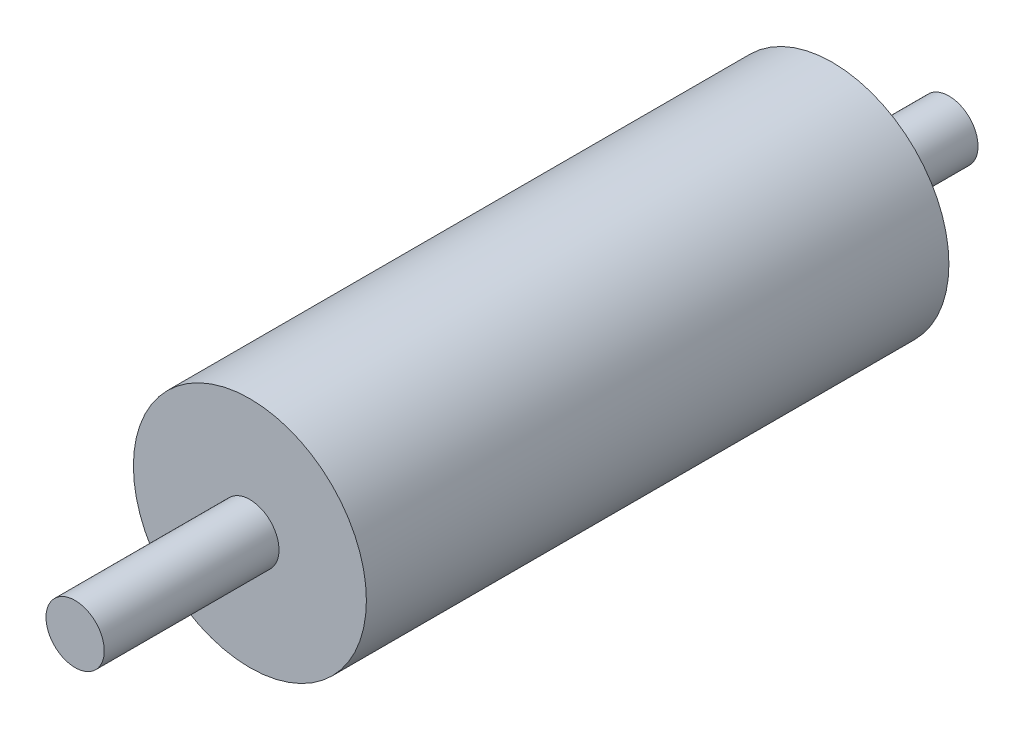
ISO-10303-21;
HEADER;
FILE_DESCRIPTION(('STEP AP214'),'2;1');
FILE_NAME('part.step','',(''),(''),'','','');
FILE_SCHEMA(('AUTOMOTIVE_DESIGN { 1 0 10303 214 1 1 1 1 }'));
ENDSEC;
DATA;
#1=APPLICATION_CONTEXT('core data for automotive mechanical design processes');
#2=APPLICATION_PROTOCOL_DEFINITION('international standard','automotive_design',2000,#1);
#3=PRODUCT_CONTEXT('',#1,'mechanical');
#4=PRODUCT('Part','Part','',(#3));
#5=PRODUCT_RELATED_PRODUCT_CATEGORY('part','',(#4));
#6=PRODUCT_DEFINITION_FORMATION('','',#4);
#7=PRODUCT_DEFINITION_CONTEXT('part definition',#1,'design');
#8=PRODUCT_DEFINITION('design','',#6,#7);
#9=PRODUCT_DEFINITION_SHAPE('','',#8);
#10=(LENGTH_UNIT() NAMED_UNIT(*) SI_UNIT(.MILLI.,.METRE.));
#11=(NAMED_UNIT(*) PLANE_ANGLE_UNIT() SI_UNIT($,.RADIAN.));
#12=(NAMED_UNIT(*) SI_UNIT($,.STERADIAN.) SOLID_ANGLE_UNIT());
#13=UNCERTAINTY_MEASURE_WITH_UNIT(LENGTH_MEASURE(1.E-05),#10,'distance_accuracy_value','');
#14=(GEOMETRIC_REPRESENTATION_CONTEXT(3) GLOBAL_UNCERTAINTY_ASSIGNED_CONTEXT((#13)) GLOBAL_UNIT_ASSIGNED_CONTEXT((#10,
#11,#12)) REPRESENTATION_CONTEXT('',''));
#15=CARTESIAN_POINT('',(0.,0.,0.));
#16=DIRECTION('',(0.,0.,1.));
#17=DIRECTION('',(1.,0.,0.));
#18=AXIS2_PLACEMENT_3D('',#15,#16,#17);
#19=CARTESIAN_POINT('',(0.,0.,0.));
#20=DIRECTION('',(0.,0.,-1.));
#21=DIRECTION('',(-1.,0.,0.));
#22=AXIS2_PLACEMENT_3D('',#19,#20,#21);
#23=CYLINDRICAL_SURFACE('',#22,5.);
#24=CARTESIAN_POINT('',(0.,0.,0.));
#25=DIRECTION('',(0.,0.,1.));
#26=DIRECTION('',(1.,0.,0.));
#27=AXIS2_PLACEMENT_3D('',#24,#25,#26);
#28=CIRCLE('',#27,5.);
#29=CARTESIAN_POINT('',(-5.,0.,0.));
#30=VERTEX_POINT('',#29);
#31=EDGE_CURVE('E56',#30,#30,#28,.T.);
#32=CARTESIAN_POINT('',(0.,0.,-20.));
#33=DIRECTION('',(0.,0.,-1.));
#34=DIRECTION('',(-1.,0.,0.));
#35=AXIS2_PLACEMENT_3D('',#32,#33,#34);
#36=CIRCLE('',#35,5.);
#37=CARTESIAN_POINT('',(-5.,0.,-20.));
#38=VERTEX_POINT('',#37);
#39=EDGE_CURVE('E41',#38,#38,#36,.T.);
#40=CARTESIAN_POINT('',(-5.,0.,0.));
#41=CARTESIAN_POINT('',(-5.,0.,-0.20833333333333));
#42=CARTESIAN_POINT('',(-5.,0.,-0.416666666666663));
#43=CARTESIAN_POINT('',(-5.,0.,-0.83333333333333));
#44=CARTESIAN_POINT('',(-5.,0.,-1.04166666666666));
#45=CARTESIAN_POINT('',(-5.,0.,-1.45833333333333));
#46=CARTESIAN_POINT('',(-5.,0.,-1.66666666666666));
#47=CARTESIAN_POINT('',(-5.,0.,-2.08333333333333));
#48=CARTESIAN_POINT('',(-5.,0.,-2.29166666666666));
#49=CARTESIAN_POINT('',(-5.,0.,-2.70833333333333));
#50=CARTESIAN_POINT('',(-5.,0.,-2.91666666666666));
#51=CARTESIAN_POINT('',(-5.,0.,-3.33333333333333));
#52=CARTESIAN_POINT('',(-5.,0.,-3.54166666666666));
#53=CARTESIAN_POINT('',(-5.,0.,-3.95833333333333));
#54=CARTESIAN_POINT('',(-5.,0.,-4.16666666666666));
#55=CARTESIAN_POINT('',(-5.,0.,-4.58333333333333));
#56=CARTESIAN_POINT('',(-5.,0.,-4.79166666666666));
#57=CARTESIAN_POINT('',(-5.,0.,-5.20833333333333));
#58=CARTESIAN_POINT('',(-5.,0.,-5.41666666666666));
#59=CARTESIAN_POINT('',(-5.,0.,-5.83333333333333));
#60=CARTESIAN_POINT('',(-5.,0.,-6.04166666666666));
#61=CARTESIAN_POINT('',(-5.,0.,-6.45833333333333));
#62=CARTESIAN_POINT('',(-5.,0.,-6.66666666666666));
#63=CARTESIAN_POINT('',(-5.,0.,-7.08333333333333));
#64=CARTESIAN_POINT('',(-5.,0.,-7.29166666666666));
#65=CARTESIAN_POINT('',(-5.,0.,-7.70833333333333));
#66=CARTESIAN_POINT('',(-5.,0.,-7.91666666666666));
#67=CARTESIAN_POINT('',(-5.,0.,-8.33333333333333));
#68=CARTESIAN_POINT('',(-5.,0.,-8.54166666666666));
#69=CARTESIAN_POINT('',(-5.,0.,-8.95833333333333));
#70=CARTESIAN_POINT('',(-5.,0.,-9.16666666666666));
#71=CARTESIAN_POINT('',(-5.,0.,-9.58333333333333));
#72=CARTESIAN_POINT('',(-5.,0.,-9.79166666666666));
#73=CARTESIAN_POINT('',(-5.,0.,-10.2083333333333));
#74=CARTESIAN_POINT('',(-5.,0.,-10.4166666666667));
#75=CARTESIAN_POINT('',(-5.,0.,-10.8333333333333));
#76=CARTESIAN_POINT('',(-5.,0.,-11.0416666666667));
#77=CARTESIAN_POINT('',(-5.,0.,-11.4583333333333));
#78=CARTESIAN_POINT('',(-5.,0.,-11.6666666666667));
#79=CARTESIAN_POINT('',(-5.,0.,-12.0833333333333));
#80=CARTESIAN_POINT('',(-5.,0.,-12.2916666666667));
#81=CARTESIAN_POINT('',(-5.,0.,-12.7083333333333));
#82=CARTESIAN_POINT('',(-5.,0.,-12.9166666666667));
#83=CARTESIAN_POINT('',(-5.,0.,-13.3333333333333));
#84=CARTESIAN_POINT('',(-5.,0.,-13.5416666666667));
#85=CARTESIAN_POINT('',(-5.,0.,-13.9583333333333));
#86=CARTESIAN_POINT('',(-5.,0.,-14.1666666666667));
#87=CARTESIAN_POINT('',(-5.,0.,-14.5833333333333));
#88=CARTESIAN_POINT('',(-5.,0.,-14.7916666666667));
#89=CARTESIAN_POINT('',(-5.,0.,-15.2083333333333));
#90=CARTESIAN_POINT('',(-5.,0.,-15.4166666666667));
#91=CARTESIAN_POINT('',(-5.,0.,-15.8333333333333));
#92=CARTESIAN_POINT('',(-5.,0.,-16.0416666666667));
#93=CARTESIAN_POINT('',(-5.,0.,-16.4583333333333));
#94=CARTESIAN_POINT('',(-5.,0.,-16.6666666666667));
#95=CARTESIAN_POINT('',(-5.,0.,-17.0833333333333));
#96=CARTESIAN_POINT('',(-5.,0.,-17.2916666666667));
#97=CARTESIAN_POINT('',(-5.,0.,-17.7083333333333));
#98=CARTESIAN_POINT('',(-5.,0.,-17.9166666666667));
#99=CARTESIAN_POINT('',(-5.,0.,-18.3333333333333));
#100=CARTESIAN_POINT('',(-5.,0.,-18.5416666666667));
#101=CARTESIAN_POINT('',(-5.,0.,-18.9583333333333));
#102=CARTESIAN_POINT('',(-5.,0.,-19.1666666666667));
#103=CARTESIAN_POINT('',(-5.,0.,-19.5833333333333));
#104=CARTESIAN_POINT('',(-5.,0.,-19.7916666666667));
#105=CARTESIAN_POINT('',(-5.,0.,-20.));
#106=B_SPLINE_CURVE_WITH_KNOTS('',3,(#40,#41,#42,#43,#44,#45,#46,#47,#48,#49,#50,#51,#52,#53,
#54,#55,#56,#57,#58,#59,#60,#61,#62,#63,#64,#65,#66,#67,#68,#69,#70,#71,#72,#73,#74,#75,#76,#77,
#78,#79,#80,#81,#82,#83,#84,#85,#86,#87,#88,#89,#90,#91,#92,#93,#94,#95,#96,#97,#98,#99,#100,
#101,#102,#103,#104,#105),.UNSPECIFIED.,.F.,.F.,(4,2,2,2,2,2,2,2,2,2,2,2,2,2,2,2,2,2,2,2,2,2,2,
2,2,2,2,2,2,2,2,2,4),(0.,0.625,1.25,1.875,2.5,3.125,3.75,4.375,5.,5.625,6.25,6.875,7.5,8.125,
8.75,9.375,10.,10.625,11.25,11.875,12.5,13.125,13.75,14.375,15.,15.625,16.25,16.875,17.5,18.125,
18.75,19.375,20.),.UNSPECIFIED.);
#107=EDGE_CURVE('BSEAM40',#30,#38,#106,.T.);
#108=ORIENTED_EDGE('',*,*,#31,.F.);
#109=ORIENTED_EDGE('',*,*,#39,.F.);
#110=ORIENTED_EDGE('',*,*,#107,.T.);
#111=ORIENTED_EDGE('',*,*,#107,.F.);
#112=EDGE_LOOP('',(#108,#110,#109,#111));
#113=FACE_BOUND('',#112,.T.);
#114=ADVANCED_FACE('F40',(#113),#23,.T.);
#115=CARTESIAN_POINT('',(0.,0.,100.));
#116=DIRECTION('',(0.,0.,-1.));
#117=DIRECTION('',(-1.,0.,0.));
#118=AXIS2_PLACEMENT_3D('',#115,#116,#117);
#119=CYLINDRICAL_SURFACE('',#118,20.);
#120=CARTESIAN_POINT('',(0.,0.,100.));
#121=DIRECTION('',(0.,0.,1.));
#122=DIRECTION('',(1.,0.,0.));
#123=AXIS2_PLACEMENT_3D('',#120,#121,#122);
#124=CIRCLE('',#123,20.);
#125=CARTESIAN_POINT('',(20.,0.,100.));
#126=VERTEX_POINT('',#125);
#127=EDGE_CURVE('E44',#126,#126,#124,.T.);
#128=ORIENTED_EDGE('',*,*,#127,.F.);
#129=EDGE_LOOP('',(#128));
#130=FACE_BOUND('',#129,.T.);
#131=CARTESIAN_POINT('',(0.,0.,0.));
#132=DIRECTION('',(0.,0.,1.));
#133=DIRECTION('',(1.,0.,0.));
#134=AXIS2_PLACEMENT_3D('',#131,#132,#133);
#135=CIRCLE('',#134,20.);
#136=CARTESIAN_POINT('',(20.,0.,0.));
#137=VERTEX_POINT('',#136);
#138=EDGE_CURVE('E49',#137,#137,#135,.T.);
#139=ORIENTED_EDGE('',*,*,#138,.T.);
#140=EDGE_LOOP('',(#139));
#141=FACE_BOUND('',#140,.T.);
#142=ADVANCED_FACE('F39',(#130,#141),#119,.T.);
#143=CARTESIAN_POINT('',(0.,0.,100.));
#144=DIRECTION('',(0.,0.,1.));
#145=DIRECTION('',(1.,0.,0.));
#146=AXIS2_PLACEMENT_3D('',#143,#144,#145);
#147=PLANE('',#146);
#148=CARTESIAN_POINT('',(0.,0.,100.));
#149=DIRECTION('',(0.,0.,1.));
#150=DIRECTION('',(1.,0.,0.));
#151=AXIS2_PLACEMENT_3D('',#148,#149,#150);
#152=CIRCLE('',#151,5.);
#153=CARTESIAN_POINT('',(-5.,0.,100.));
#154=VERTEX_POINT('',#153);
#155=EDGE_CURVE('E10',#154,#154,#152,.T.);
#156=ORIENTED_EDGE('',*,*,#155,.F.);
#157=EDGE_LOOP('',(#156));
#158=FACE_BOUND('',#157,.T.);
#159=ORIENTED_EDGE('',*,*,#127,.T.);
#160=EDGE_LOOP('',(#159));
#161=FACE_BOUND('',#160,.T.);
#162=ADVANCED_FACE('F78',(#158,#161),#147,.T.);
#163=CARTESIAN_POINT('',(0.,0.,0.));
#164=DIRECTION('',(0.,0.,1.));
#165=DIRECTION('',(1.,0.,0.));
#166=AXIS2_PLACEMENT_3D('',#163,#164,#165);
#167=PLANE('',#166);
#168=ORIENTED_EDGE('',*,*,#31,.T.);
#169=EDGE_LOOP('',(#168));
#170=FACE_BOUND('',#169,.T.);
#171=ORIENTED_EDGE('',*,*,#138,.F.);
#172=EDGE_LOOP('',(#171));
#173=FACE_BOUND('',#172,.T.);
#174=ADVANCED_FACE('F86',(#170,#173),#167,.F.);
#175=CARTESIAN_POINT('',(0.,0.,130.));
#176=DIRECTION('',(0.,0.,-1.));
#177=DIRECTION('',(-1.,0.,0.));
#178=AXIS2_PLACEMENT_3D('',#175,#176,#177);
#179=CYLINDRICAL_SURFACE('',#178,5.);
#180=CARTESIAN_POINT('',(0.,0.,130.));
#181=DIRECTION('',(0.,0.,1.));
#182=DIRECTION('',(1.,0.,0.));
#183=AXIS2_PLACEMENT_3D('',#180,#181,#182);
#184=CIRCLE('',#183,5.);
#185=CARTESIAN_POINT('',(-5.,0.,130.));
#186=VERTEX_POINT('',#185);
#187=EDGE_CURVE('E52',#186,#186,#184,.T.);
#188=CARTESIAN_POINT('',(-5.,0.,130.));
#189=CARTESIAN_POINT('',(-5.,0.,129.6875));
#190=CARTESIAN_POINT('',(-5.,0.,129.375));
#191=CARTESIAN_POINT('',(-5.,0.,128.75));
#192=CARTESIAN_POINT('',(-5.,0.,128.4375));
#193=CARTESIAN_POINT('',(-5.,0.,127.8125));
#194=CARTESIAN_POINT('',(-5.,0.,127.5));
#195=CARTESIAN_POINT('',(-5.,0.,126.875));
#196=CARTESIAN_POINT('',(-5.,0.,126.5625));
#197=CARTESIAN_POINT('',(-5.,0.,125.9375));
#198=CARTESIAN_POINT('',(-5.,0.,125.625));
#199=CARTESIAN_POINT('',(-5.,0.,125.));
#200=CARTESIAN_POINT('',(-5.,0.,124.6875));
#201=CARTESIAN_POINT('',(-5.,0.,124.0625));
#202=CARTESIAN_POINT('',(-5.,0.,123.75));
#203=CARTESIAN_POINT('',(-5.,0.,123.125));
#204=CARTESIAN_POINT('',(-5.,0.,122.8125));
#205=CARTESIAN_POINT('',(-5.,0.,122.1875));
#206=CARTESIAN_POINT('',(-5.,0.,121.875));
#207=CARTESIAN_POINT('',(-5.,0.,121.25));
#208=CARTESIAN_POINT('',(-5.,0.,120.9375));
#209=CARTESIAN_POINT('',(-5.,0.,120.3125));
#210=CARTESIAN_POINT('',(-5.,0.,120.));
#211=CARTESIAN_POINT('',(-5.,0.,119.375));
#212=CARTESIAN_POINT('',(-5.,0.,119.0625));
#213=CARTESIAN_POINT('',(-5.,0.,118.4375));
#214=CARTESIAN_POINT('',(-5.,0.,118.125));
#215=CARTESIAN_POINT('',(-5.,0.,117.5));
#216=CARTESIAN_POINT('',(-5.,0.,117.1875));
#217=CARTESIAN_POINT('',(-5.,0.,116.5625));
#218=CARTESIAN_POINT('',(-5.,0.,116.25));
#219=CARTESIAN_POINT('',(-5.,0.,115.625));
#220=CARTESIAN_POINT('',(-5.,0.,115.3125));
#221=CARTESIAN_POINT('',(-5.,0.,114.6875));
#222=CARTESIAN_POINT('',(-5.,0.,114.375));
#223=CARTESIAN_POINT('',(-5.,0.,113.75));
#224=CARTESIAN_POINT('',(-5.,0.,113.4375));
#225=CARTESIAN_POINT('',(-5.,0.,112.8125));
#226=CARTESIAN_POINT('',(-5.,0.,112.5));
#227=CARTESIAN_POINT('',(-5.,0.,111.875));
#228=CARTESIAN_POINT('',(-5.,0.,111.5625));
#229=CARTESIAN_POINT('',(-5.,0.,110.9375));
#230=CARTESIAN_POINT('',(-5.,0.,110.625));
#231=CARTESIAN_POINT('',(-5.,0.,110.));
#232=CARTESIAN_POINT('',(-5.,0.,109.6875));
#233=CARTESIAN_POINT('',(-5.,0.,109.0625));
#234=CARTESIAN_POINT('',(-5.,0.,108.75));
#235=CARTESIAN_POINT('',(-5.,0.,108.125));
#236=CARTESIAN_POINT('',(-5.,0.,107.8125));
#237=CARTESIAN_POINT('',(-5.,0.,107.1875));
#238=CARTESIAN_POINT('',(-5.,0.,106.875));
#239=CARTESIAN_POINT('',(-5.,0.,106.25));
#240=CARTESIAN_POINT('',(-5.,0.,105.9375));
#241=CARTESIAN_POINT('',(-5.,0.,105.3125));
#242=CARTESIAN_POINT('',(-5.,0.,105.));
#243=CARTESIAN_POINT('',(-5.,0.,104.375));
#244=CARTESIAN_POINT('',(-5.,0.,104.0625));
#245=CARTESIAN_POINT('',(-5.,0.,103.4375));
#246=CARTESIAN_POINT('',(-5.,0.,103.125));
#247=CARTESIAN_POINT('',(-5.,0.,102.5));
#248=CARTESIAN_POINT('',(-5.,0.,102.1875));
#249=CARTESIAN_POINT('',(-5.,0.,101.5625));
#250=CARTESIAN_POINT('',(-5.,0.,101.25));
#251=CARTESIAN_POINT('',(-5.,0.,100.625));
#252=CARTESIAN_POINT('',(-5.,0.,100.3125));
#253=CARTESIAN_POINT('',(-5.,0.,100.));
#254=B_SPLINE_CURVE_WITH_KNOTS('',3,(#188,#189,#190,#191,#192,#193,#194,#195,#196,#197,#198,
#199,#200,#201,#202,#203,#204,#205,#206,#207,#208,#209,#210,#211,#212,#213,#214,#215,#216,#217,
#218,#219,#220,#221,#222,#223,#224,#225,#226,#227,#228,#229,#230,#231,#232,#233,#234,#235,#236,
#237,#238,#239,#240,#241,#242,#243,#244,#245,#246,#247,#248,#249,#250,#251,#252,#253),
.UNSPECIFIED.,.F.,.F.,(4,2,2,2,2,2,2,2,2,2,2,2,2,2,2,2,2,2,2,2,2,2,2,2,2,2,2,2,2,2,2,2,4),(0.,
0.93749999999998,1.87499999999999,2.8125,3.74999999999998,4.68749999999998,5.62499999999999,
6.56249999999998,7.49999999999998,8.43749999999999,9.37499999999998,10.3125,11.25,12.1875,
13.125,14.0625,15.,15.9375,16.875,17.8125,18.75,19.6875,20.625,21.5625,22.5,23.4375,24.375,
25.3125,26.25,27.1875,28.125,29.0625,30.),.UNSPECIFIED.);
#255=EDGE_CURVE('BSEAM85',#186,#154,#254,.T.);
#256=ORIENTED_EDGE('',*,*,#187,.F.);
#257=ORIENTED_EDGE('',*,*,#155,.T.);
#258=ORIENTED_EDGE('',*,*,#255,.T.);
#259=ORIENTED_EDGE('',*,*,#255,.F.);
#260=EDGE_LOOP('',(#256,#258,#257,#259));
#261=FACE_BOUND('',#260,.T.);
#262=ADVANCED_FACE('F85',(#261),#179,.T.);
#263=CARTESIAN_POINT('',(0.,0.,130.));
#264=DIRECTION('',(0.,0.,1.));
#265=DIRECTION('',(1.,0.,0.));
#266=AXIS2_PLACEMENT_3D('',#263,#264,#265);
#267=PLANE('',#266);
#268=ORIENTED_EDGE('',*,*,#187,.T.);
#269=EDGE_LOOP('',(#268));
#270=FACE_BOUND('',#269,.T.);
#271=ADVANCED_FACE('F82',(#270),#267,.T.);
#272=CARTESIAN_POINT('',(0.,0.,-20.));
#273=DIRECTION('',(0.,0.,-1.));
#274=DIRECTION('',(-1.,0.,0.));
#275=AXIS2_PLACEMENT_3D('',#272,#273,#274);
#276=PLANE('',#275);
#277=ORIENTED_EDGE('',*,*,#39,.T.);
#278=EDGE_LOOP('',(#277));
#279=FACE_BOUND('',#278,.T.);
#280=ADVANCED_FACE('F69',(#279),#276,.T.);
#281=CLOSED_SHELL('',(#114,#142,#162,#174,#262,#271,#280));
#282=MANIFOLD_SOLID_BREP('B2',#281);
#283=ADVANCED_BREP_SHAPE_REPRESENTATION('',(#18,#282),#14);
#284=SHAPE_DEFINITION_REPRESENTATION(#9,#283);
ENDSEC;
END-ISO-10303-21;
